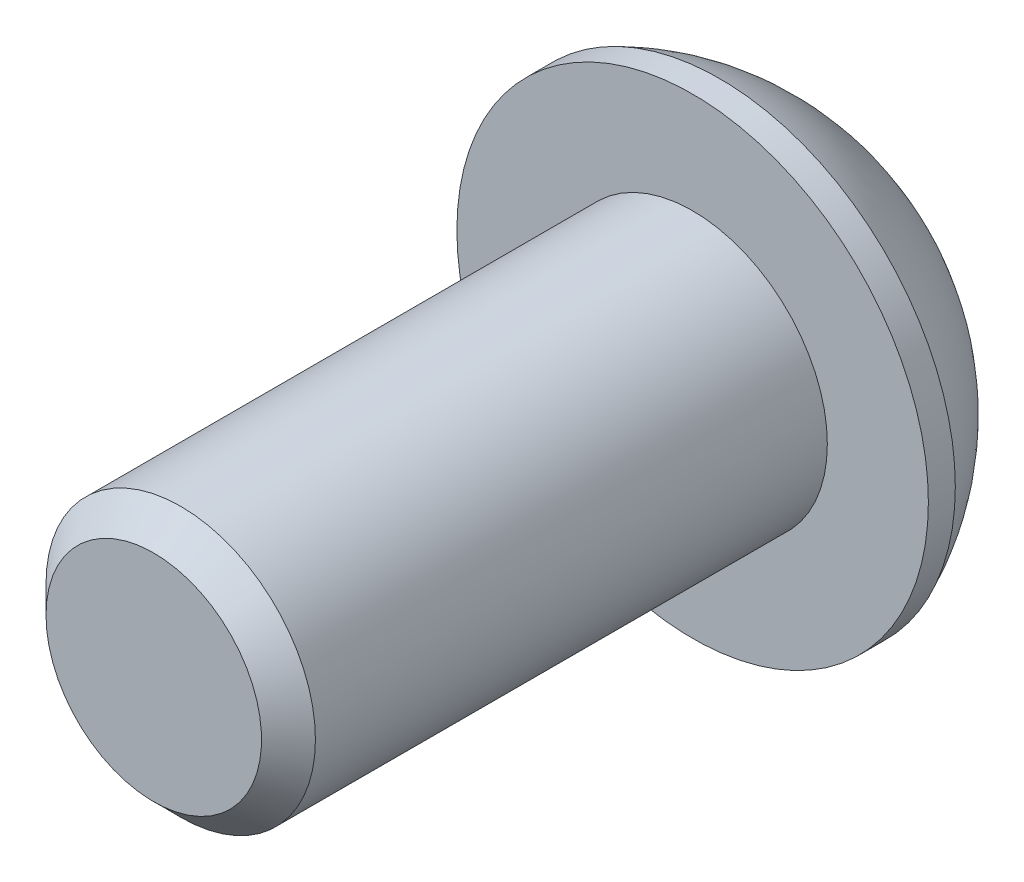
ISO-10303-21;
HEADER;
FILE_DESCRIPTION(('STEP AP214'),'2;1');
FILE_NAME('part.step','',(''),(''),'','','');
FILE_SCHEMA(('AUTOMOTIVE_DESIGN { 1 0 10303 214 1 1 1 1 }'));
ENDSEC;
DATA;
#1=APPLICATION_CONTEXT('core data for automotive mechanical design processes');
#2=APPLICATION_PROTOCOL_DEFINITION('international standard','automotive_design',2000,#1);
#3=PRODUCT_CONTEXT('',#1,'mechanical');
#4=PRODUCT('Part','Part','',(#3));
#5=PRODUCT_RELATED_PRODUCT_CATEGORY('part','',(#4));
#6=PRODUCT_DEFINITION_FORMATION('','',#4);
#7=PRODUCT_DEFINITION_CONTEXT('part definition',#1,'design');
#8=PRODUCT_DEFINITION('design','',#6,#7);
#9=PRODUCT_DEFINITION_SHAPE('','',#8);
#10=(LENGTH_UNIT() NAMED_UNIT(*) SI_UNIT(.MILLI.,.METRE.));
#11=(NAMED_UNIT(*) PLANE_ANGLE_UNIT() SI_UNIT($,.RADIAN.));
#12=(NAMED_UNIT(*) SI_UNIT($,.STERADIAN.) SOLID_ANGLE_UNIT());
#13=UNCERTAINTY_MEASURE_WITH_UNIT(LENGTH_MEASURE(1.E-05),#10,'distance_accuracy_value','');
#14=(GEOMETRIC_REPRESENTATION_CONTEXT(3) GLOBAL_UNCERTAINTY_ASSIGNED_CONTEXT((#13)) GLOBAL_UNIT_ASSIGNED_CONTEXT((#10,
#11,#12)) REPRESENTATION_CONTEXT('',''));
#15=CARTESIAN_POINT('',(0.,0.,0.));
#16=DIRECTION('',(0.,0.,1.));
#17=DIRECTION('',(1.,0.,0.));
#18=AXIS2_PLACEMENT_3D('',#15,#16,#17);
#19=CARTESIAN_POINT('',(0.,0.,-2.1));
#20=DIRECTION('',(0.,0.,1.));
#21=DIRECTION('',(1.,0.,0.));
#22=AXIS2_PLACEMENT_3D('',#19,#20,#21);
#23=PLANE('',#22);
#24=DIRECTION('',(-0.866025403784439,0.5,0.));
#25=VECTOR('',#24,1.);
#26=CARTESIAN_POINT('',(0.,2.88675134594813,-2.1));
#27=LINE('',#26,#25);
#28=CARTESIAN_POINT('',(0.,2.88675134594813,-2.1));
#29=VERTEX_POINT('',#28);
#30=CARTESIAN_POINT('',(2.5,1.44337567297406,-2.1));
#31=VERTEX_POINT('',#30);
#32=EDGE_CURVE('E72',#29,#31,#27,.F.);
#33=ORIENTED_EDGE('',*,*,#32,.T.);
#34=DIRECTION('',(0.,1.,0.));
#35=VECTOR('',#34,1.);
#36=CARTESIAN_POINT('',(2.5,1.44337567297406,-2.1));
#37=LINE('',#36,#35);
#38=CARTESIAN_POINT('',(2.5,-1.44337567297406,-2.1));
#39=VERTEX_POINT('',#38);
#40=EDGE_CURVE('E125',#31,#39,#37,.F.);
#41=ORIENTED_EDGE('',*,*,#40,.T.);
#42=DIRECTION('',(0.866025403784439,0.499999999999999,0.));
#43=VECTOR('',#42,1.);
#44=CARTESIAN_POINT('',(2.5,-1.44337567297406,-2.1));
#45=LINE('',#44,#43);
#46=CARTESIAN_POINT('',(0.,-2.88675134594813,-2.1));
#47=VERTEX_POINT('',#46);
#48=EDGE_CURVE('E130',#39,#47,#45,.F.);
#49=ORIENTED_EDGE('',*,*,#48,.T.);
#50=DIRECTION('',(0.866025403784438,-0.5,0.));
#51=VECTOR('',#50,1.);
#52=CARTESIAN_POINT('',(0.,-2.88675134594813,-2.1));
#53=LINE('',#52,#51);
#54=CARTESIAN_POINT('',(-2.5,-1.44337567297406,-2.1));
#55=VERTEX_POINT('',#54);
#56=EDGE_CURVE('E134',#47,#55,#53,.F.);
#57=ORIENTED_EDGE('',*,*,#56,.T.);
#58=DIRECTION('',(0.,1.,0.));
#59=VECTOR('',#58,1.);
#60=CARTESIAN_POINT('',(-2.5,-1.44337567297406,-2.1));
#61=LINE('',#60,#59);
#62=CARTESIAN_POINT('',(-2.5,1.44337567297406,-2.1));
#63=VERTEX_POINT('',#62);
#64=EDGE_CURVE('E68',#55,#63,#61,.T.);
#65=ORIENTED_EDGE('',*,*,#64,.T.);
#66=DIRECTION('',(-0.866025403784439,-0.5,0.));
#67=VECTOR('',#66,1.);
#68=CARTESIAN_POINT('',(-2.5,1.44337567297406,-2.1));
#69=LINE('',#68,#67);
#70=EDGE_CURVE('E70',#63,#29,#69,.F.);
#71=ORIENTED_EDGE('',*,*,#70,.T.);
#72=EDGE_LOOP('',(#33,#41,#49,#57,#65,#71));
#73=FACE_BOUND('',#72,.T.);
#74=ADVANCED_FACE('F17',(#73),#23,.F.);
#75=CARTESIAN_POINT('',(0.,2.88675134594813,-4.4));
#76=DIRECTION('',(0.5,0.866025403784439,0.));
#77=DIRECTION('',(-0.866025403784439,0.5,0.));
#78=AXIS2_PLACEMENT_3D('',#75,#76,#77);
#79=PLANE('',#78);
#80=ORIENTED_EDGE('',*,*,#32,.F.);
#81=DIRECTION('',(0.,0.,1.));
#82=VECTOR('',#81,1.);
#83=CARTESIAN_POINT('',(0.,2.88675134594813,-4.4));
#84=LINE('',#83,#82);
#85=CARTESIAN_POINT('',(0.,2.88675134594813,-4.4));
#86=VERTEX_POINT('',#85);
#87=EDGE_CURVE('E77',#29,#86,#84,.F.);
#88=ORIENTED_EDGE('',*,*,#87,.T.);
#89=DIRECTION('',(-0.866025403784438,0.500000000000002,0.));
#90=VECTOR('',#89,1.);
#91=CARTESIAN_POINT('',(2.5,1.44337567297406,-4.4));
#92=LINE('',#91,#90);
#93=CARTESIAN_POINT('',(2.5,1.44337567297406,-4.4));
#94=VERTEX_POINT('',#93);
#95=EDGE_CURVE('E122',#94,#86,#92,.T.);
#96=ORIENTED_EDGE('',*,*,#95,.F.);
#97=DIRECTION('',(0.,0.,-1.));
#98=VECTOR('',#97,1.);
#99=CARTESIAN_POINT('',(2.5,1.44337567297406,-4.4));
#100=LINE('',#99,#98);
#101=EDGE_CURVE('E83',#94,#31,#100,.F.);
#102=ORIENTED_EDGE('',*,*,#101,.T.);
#103=EDGE_LOOP('',(#80,#88,#96,#102));
#104=FACE_BOUND('',#103,.T.);
#105=ADVANCED_FACE('F80',(#104),#79,.F.);
#106=CARTESIAN_POINT('',(-2.5,1.44337567297406,-4.4));
#107=DIRECTION('',(-0.5,0.866025403784439,0.));
#108=DIRECTION('',(-0.866025403784439,-0.5,0.));
#109=AXIS2_PLACEMENT_3D('',#106,#107,#108);
#110=PLANE('',#109);
#111=ORIENTED_EDGE('',*,*,#70,.F.);
#112=DIRECTION('',(0.,0.,1.));
#113=VECTOR('',#112,1.);
#114=CARTESIAN_POINT('',(-2.5,1.44337567297406,-4.4));
#115=LINE('',#114,#113);
#116=CARTESIAN_POINT('',(-2.5,1.44337567297406,-4.4));
#117=VERTEX_POINT('',#116);
#118=EDGE_CURVE('E91',#63,#117,#115,.F.);
#119=ORIENTED_EDGE('',*,*,#118,.T.);
#120=DIRECTION('',(-0.866025403784438,-0.500000000000001,0.));
#121=VECTOR('',#120,1.);
#122=CARTESIAN_POINT('',(0.,2.88675134594813,-4.4));
#123=LINE('',#122,#121);
#124=EDGE_CURVE('E88',#86,#117,#123,.T.);
#125=ORIENTED_EDGE('',*,*,#124,.F.);
#126=ORIENTED_EDGE('',*,*,#87,.F.);
#127=EDGE_LOOP('',(#111,#119,#125,#126));
#128=FACE_BOUND('',#127,.T.);
#129=ADVANCED_FACE('F86',(#128),#110,.F.);
#130=CARTESIAN_POINT('',(-2.5,-1.44337567297406,-4.4));
#131=DIRECTION('',(-1.,0.,0.));
#132=DIRECTION('',(0.,0.,1.));
#133=AXIS2_PLACEMENT_3D('',#130,#131,#132);
#134=PLANE('',#133);
#135=ORIENTED_EDGE('',*,*,#64,.F.);
#136=DIRECTION('',(0.,0.,1.));
#137=VECTOR('',#136,1.);
#138=CARTESIAN_POINT('',(-2.5,-1.44337567297406,-4.4));
#139=LINE('',#138,#137);
#140=CARTESIAN_POINT('',(-2.5,-1.44337567297406,-4.4));
#141=VERTEX_POINT('',#140);
#142=EDGE_CURVE('E132',#55,#141,#139,.F.);
#143=ORIENTED_EDGE('',*,*,#142,.T.);
#144=DIRECTION('',(0.,1.,0.));
#145=VECTOR('',#144,1.);
#146=CARTESIAN_POINT('',(-2.5,-1.75,-4.4));
#147=LINE('',#146,#145);
#148=EDGE_CURVE('E118',#117,#141,#147,.F.);
#149=ORIENTED_EDGE('',*,*,#148,.F.);
#150=ORIENTED_EDGE('',*,*,#118,.F.);
#151=EDGE_LOOP('',(#135,#143,#149,#150));
#152=FACE_BOUND('',#151,.T.);
#153=ADVANCED_FACE('F137',(#152),#134,.F.);
#154=CARTESIAN_POINT('',(0.,-2.88675134594813,-4.4));
#155=DIRECTION('',(-0.5,-0.866025403784438,0.));
#156=DIRECTION('',(0.866025403784438,-0.5,0.));
#157=AXIS2_PLACEMENT_3D('',#154,#155,#156);
#158=PLANE('',#157);
#159=ORIENTED_EDGE('',*,*,#56,.F.);
#160=DIRECTION('',(0.,0.,1.));
#161=VECTOR('',#160,1.);
#162=CARTESIAN_POINT('',(0.,-2.88675134594812,-4.4));
#163=LINE('',#162,#161);
#164=CARTESIAN_POINT('',(0.,-2.88675134594813,-4.4));
#165=VERTEX_POINT('',#164);
#166=EDGE_CURVE('E128',#47,#165,#163,.F.);
#167=ORIENTED_EDGE('',*,*,#166,.T.);
#168=DIRECTION('',(0.866025403784438,-0.500000000000002,0.));
#169=VECTOR('',#168,1.);
#170=CARTESIAN_POINT('',(-2.5,-1.44337567297406,-4.4));
#171=LINE('',#170,#169);
#172=EDGE_CURVE('E115',#141,#165,#171,.T.);
#173=ORIENTED_EDGE('',*,*,#172,.F.);
#174=ORIENTED_EDGE('',*,*,#142,.F.);
#175=EDGE_LOOP('',(#159,#167,#173,#174));
#176=FACE_BOUND('',#175,.T.);
#177=ADVANCED_FACE('F149',(#176),#158,.F.);
#178=CARTESIAN_POINT('',(2.5,-1.44337567297406,-4.4));
#179=DIRECTION('',(0.499999999999999,-0.866025403784439,0.));
#180=DIRECTION('',(0.866025403784439,0.499999999999999,0.));
#181=AXIS2_PLACEMENT_3D('',#178,#179,#180);
#182=PLANE('',#181);
#183=ORIENTED_EDGE('',*,*,#48,.F.);
#184=DIRECTION('',(0.,0.,-1.));
#185=VECTOR('',#184,1.);
#186=CARTESIAN_POINT('',(2.5,-1.44337567297406,-4.4));
#187=LINE('',#186,#185);
#188=CARTESIAN_POINT('',(2.5,-1.44337567297406,-4.4));
#189=VERTEX_POINT('',#188);
#190=EDGE_CURVE('E35',#39,#189,#187,.T.);
#191=ORIENTED_EDGE('',*,*,#190,.T.);
#192=DIRECTION('',(0.866025403784438,0.500000000000001,0.));
#193=VECTOR('',#192,1.);
#194=CARTESIAN_POINT('',(0.,-2.88675134594813,-4.4));
#195=LINE('',#194,#193);
#196=EDGE_CURVE('E112',#165,#189,#195,.T.);
#197=ORIENTED_EDGE('',*,*,#196,.F.);
#198=ORIENTED_EDGE('',*,*,#166,.F.);
#199=EDGE_LOOP('',(#183,#191,#197,#198));
#200=FACE_BOUND('',#199,.T.);
#201=ADVANCED_FACE('F147',(#200),#182,.F.);
#202=CARTESIAN_POINT('',(2.5,1.44337567297406,-4.4));
#203=DIRECTION('',(1.,0.,0.));
#204=DIRECTION('',(0.,0.,-1.));
#205=AXIS2_PLACEMENT_3D('',#202,#203,#204);
#206=PLANE('',#205);
#207=ORIENTED_EDGE('',*,*,#40,.F.);
#208=ORIENTED_EDGE('',*,*,#101,.F.);
#209=DIRECTION('',(0.,1.,0.));
#210=VECTOR('',#209,1.);
#211=CARTESIAN_POINT('',(2.5,-1.75,-4.4));
#212=LINE('',#211,#210);
#213=EDGE_CURVE('E107',#189,#94,#212,.T.);
#214=ORIENTED_EDGE('',*,*,#213,.F.);
#215=ORIENTED_EDGE('',*,*,#190,.F.);
#216=EDGE_LOOP('',(#207,#208,#214,#215));
#217=FACE_BOUND('',#216,.T.);
#218=ADVANCED_FACE('F144',(#217),#206,.F.);
#219=CARTESIAN_POINT('',(0.,-1.75,-4.4));
#220=DIRECTION('',(0.,0.,-1.));
#221=DIRECTION('',(-1.,0.,0.));
#222=AXIS2_PLACEMENT_3D('',#219,#220,#221);
#223=PLANE('',#222);
#224=ORIENTED_EDGE('',*,*,#196,.T.);
#225=ORIENTED_EDGE('',*,*,#213,.T.);
#226=ORIENTED_EDGE('',*,*,#95,.T.);
#227=ORIENTED_EDGE('',*,*,#124,.T.);
#228=ORIENTED_EDGE('',*,*,#148,.T.);
#229=ORIENTED_EDGE('',*,*,#172,.T.);
#230=EDGE_LOOP('',(#224,#225,#226,#227,#228,#229));
#231=FACE_BOUND('',#230,.T.);
#232=CARTESIAN_POINT('',(0.,0.,-4.4));
#233=DIRECTION('',(0.,0.,-1.));
#234=DIRECTION('',(-1.,0.,0.));
#235=AXIS2_PLACEMENT_3D('',#232,#233,#234);
#236=CIRCLE('',#235,3.5);
#237=CARTESIAN_POINT('',(-3.5,0.,-4.4));
#238=VERTEX_POINT('',#237);
#239=EDGE_CURVE('E20',#238,#238,#236,.F.);
#240=ORIENTED_EDGE('',*,*,#239,.F.);
#241=EDGE_LOOP('',(#240));
#242=FACE_BOUND('',#241,.T.);
#243=ADVANCED_FACE('F141',(#231,#242),#223,.T.);
#244=CARTESIAN_POINT('',(0.,0.,2.17249999999999));
#245=DIRECTION('',(0.,0.,-1.));
#246=DIRECTION('',(0.,-1.,0.));
#247=AXIS2_PLACEMENT_3D('',#244,#245,#246);
#248=DEGENERATE_TOROIDAL_SURFACE('',#247,0.341142857142867,7.29219683627502,.T.);
#249=CARTESIAN_POINT('',(0.,0.,-0.800000000000004));
#250=DIRECTION('',(0.,0.,-1.));
#251=DIRECTION('',(-1.,0.,0.));
#252=AXIS2_PLACEMENT_3D('',#249,#250,#251);
#253=CIRCLE('',#252,7.);
#254=CARTESIAN_POINT('',(-7.,0.,-0.800000000000004));
#255=VERTEX_POINT('',#254);
#256=EDGE_CURVE('E99',#255,#255,#253,.F.);
#257=ORIENTED_EDGE('',*,*,#256,.F.);
#258=EDGE_LOOP('',(#257));
#259=FACE_BOUND('',#258,.T.);
#260=ORIENTED_EDGE('',*,*,#239,.T.);
#261=EDGE_LOOP('',(#260));
#262=FACE_BOUND('',#261,.T.);
#263=ADVANCED_FACE('F182',(#259,#262),#248,.T.);
#264=CARTESIAN_POINT('',(0.,0.,16.));
#265=DIRECTION('',(0.,0.,1.));
#266=DIRECTION('',(1.,0.,0.));
#267=AXIS2_PLACEMENT_3D('',#264,#265,#266);
#268=PLANE('',#267);
#269=CARTESIAN_POINT('',(0.,0.,15.9999999999059));
#270=DIRECTION('',(0.,0.,-1.));
#271=DIRECTION('',(-1.,0.,0.));
#272=AXIS2_PLACEMENT_3D('',#269,#270,#271);
#273=CIRCLE('',#272,3.20000000004939);
#274=CARTESIAN_POINT('',(-3.20000000004939,0.,15.9999999999059));
#275=VERTEX_POINT('',#274);
#276=EDGE_CURVE('E97',#275,#275,#273,.T.);
#277=ORIENTED_EDGE('',*,*,#276,.F.);
#278=EDGE_LOOP('',(#277));
#279=FACE_BOUND('',#278,.T.);
#280=ADVANCED_FACE('F178',(#279),#268,.T.);
#281=CARTESIAN_POINT('',(0.,0.,-0.4));
#282=DIRECTION('',(0.,0.,-1.));
#283=DIRECTION('',(-1.,0.,0.));
#284=AXIS2_PLACEMENT_3D('',#281,#282,#283);
#285=CYLINDRICAL_SURFACE('',#284,7.);
#286=CARTESIAN_POINT('',(0.,0.,0.));
#287=DIRECTION('',(0.,0.,-1.));
#288=DIRECTION('',(-1.,0.,0.));
#289=AXIS2_PLACEMENT_3D('',#286,#287,#288);
#290=CIRCLE('',#289,7.);
#291=CARTESIAN_POINT('',(-7.,0.,0.));
#292=VERTEX_POINT('',#291);
#293=EDGE_CURVE('E95',#292,#292,#290,.T.);
#294=ORIENTED_EDGE('',*,*,#293,.T.);
#295=EDGE_LOOP('',(#294));
#296=FACE_BOUND('',#295,.T.);
#297=ORIENTED_EDGE('',*,*,#256,.T.);
#298=EDGE_LOOP('',(#297));
#299=FACE_BOUND('',#298,.T.);
#300=ADVANCED_FACE('F174',(#296,#299),#285,.T.);
#301=CARTESIAN_POINT('',(0.,0.,15.2000000000498));
#302=DIRECTION('',(0.,0.,-1.));
#303=DIRECTION('',(-1.,0.,0.));
#304=AXIS2_PLACEMENT_3D('',#301,#302,#303);
#305=CONICAL_SURFACE('',#304,3.99999999990541,0.785398163397448);
#306=CARTESIAN_POINT('',(0.,0.,15.2));
#307=DIRECTION('',(0.,0.,1.));
#308=DIRECTION('',(1.,0.,0.));
#309=AXIS2_PLACEMENT_3D('',#306,#307,#308);
#310=CIRCLE('',#309,4.);
#311=CARTESIAN_POINT('',(4.,0.,15.2));
#312=VERTEX_POINT('',#311);
#313=EDGE_CURVE('E26',#312,#312,#310,.F.);
#314=ORIENTED_EDGE('',*,*,#313,.F.);
#315=EDGE_LOOP('',(#314));
#316=FACE_BOUND('',#315,.T.);
#317=ORIENTED_EDGE('',*,*,#276,.T.);
#318=EDGE_LOOP('',(#317));
#319=FACE_BOUND('',#318,.T.);
#320=ADVANCED_FACE('F167',(#316,#319),#305,.T.);
#321=CARTESIAN_POINT('',(0.,-3.5,0.));
#322=DIRECTION('',(0.,0.,-1.));
#323=DIRECTION('',(-1.,0.,0.));
#324=AXIS2_PLACEMENT_3D('',#321,#322,#323);
#325=PLANE('',#324);
#326=CARTESIAN_POINT('',(0.,0.,0.));
#327=DIRECTION('',(0.,0.,1.));
#328=DIRECTION('',(1.,0.,0.));
#329=AXIS2_PLACEMENT_3D('',#326,#327,#328);
#330=CIRCLE('',#329,4.);
#331=CARTESIAN_POINT('',(4.,0.,0.));
#332=VERTEX_POINT('',#331);
#333=EDGE_CURVE('E11',#332,#332,#330,.T.);
#334=ORIENTED_EDGE('',*,*,#333,.F.);
#335=EDGE_LOOP('',(#334));
#336=FACE_BOUND('',#335,.T.);
#337=ORIENTED_EDGE('',*,*,#293,.F.);
#338=EDGE_LOOP('',(#337));
#339=FACE_BOUND('',#338,.T.);
#340=ADVANCED_FACE('F161',(#336,#339),#325,.F.);
#341=CARTESIAN_POINT('',(0.,0.,0.));
#342=DIRECTION('',(0.,0.,1.));
#343=DIRECTION('',(1.,0.,0.));
#344=AXIS2_PLACEMENT_3D('',#341,#342,#343);
#345=CYLINDRICAL_SURFACE('',#344,4.);
#346=ORIENTED_EDGE('',*,*,#333,.T.);
#347=EDGE_LOOP('',(#346));
#348=FACE_BOUND('',#347,.T.);
#349=ORIENTED_EDGE('',*,*,#313,.T.);
#350=EDGE_LOOP('',(#349));
#351=FACE_BOUND('',#350,.T.);
#352=ADVANCED_FACE('F159',(#348,#351),#345,.T.);
#353=CLOSED_SHELL('',(#74,#105,#129,#153,#177,#201,#218,#243,#263,#280,#300,#320,#340,#352));
#354=MANIFOLD_SOLID_BREP('B1',#353);
#355=ADVANCED_BREP_SHAPE_REPRESENTATION('',(#18,#354),#14);
#356=SHAPE_DEFINITION_REPRESENTATION(#9,#355);
ENDSEC;
END-ISO-10303-21;
